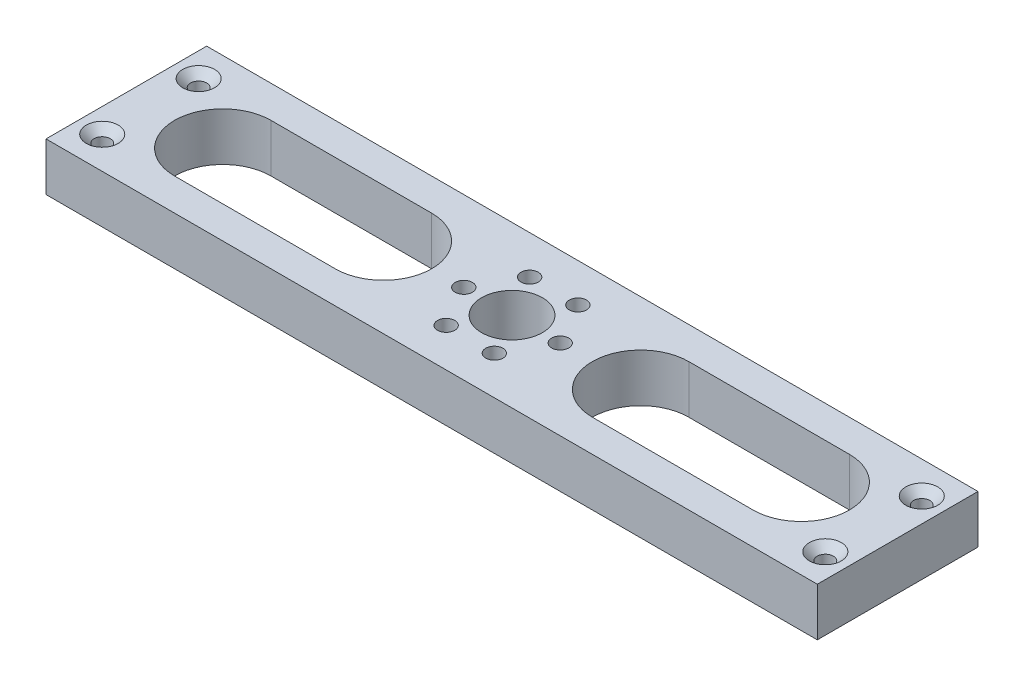
ISO-10303-21;
HEADER;
FILE_DESCRIPTION(('STEP AP214'),'2;1');
FILE_NAME('part.step','',(''),(''),'','','');
FILE_SCHEMA(('AUTOMOTIVE_DESIGN { 1 0 10303 214 1 1 1 1 }'));
ENDSEC;
DATA;
#1=APPLICATION_CONTEXT('core data for automotive mechanical design processes');
#2=APPLICATION_PROTOCOL_DEFINITION('international standard','automotive_design',2000,#1);
#3=PRODUCT_CONTEXT('',#1,'mechanical');
#4=PRODUCT('Part','Part','',(#3));
#5=PRODUCT_RELATED_PRODUCT_CATEGORY('part','',(#4));
#6=PRODUCT_DEFINITION_FORMATION('','',#4);
#7=PRODUCT_DEFINITION_CONTEXT('part definition',#1,'design');
#8=PRODUCT_DEFINITION('design','',#6,#7);
#9=PRODUCT_DEFINITION_SHAPE('','',#8);
#10=(LENGTH_UNIT() NAMED_UNIT(*) SI_UNIT(.MILLI.,.METRE.));
#11=(NAMED_UNIT(*) PLANE_ANGLE_UNIT() SI_UNIT($,.RADIAN.));
#12=(NAMED_UNIT(*) SI_UNIT($,.STERADIAN.) SOLID_ANGLE_UNIT());
#13=UNCERTAINTY_MEASURE_WITH_UNIT(LENGTH_MEASURE(1.E-05),#10,'distance_accuracy_value','');
#14=(GEOMETRIC_REPRESENTATION_CONTEXT(3) GLOBAL_UNCERTAINTY_ASSIGNED_CONTEXT((#13)) GLOBAL_UNIT_ASSIGNED_CONTEXT((#10,
#11,#12)) REPRESENTATION_CONTEXT('',''));
#15=CARTESIAN_POINT('',(0.,0.,0.));
#16=DIRECTION('',(0.,0.,1.));
#17=DIRECTION('',(1.,0.,0.));
#18=AXIS2_PLACEMENT_3D('',#15,#16,#17);
#19=CARTESIAN_POINT('',(76.2,4.7625,15.875));
#20=DIRECTION('',(-1.,0.,0.));
#21=DIRECTION('',(0.,0.,1.));
#22=AXIS2_PLACEMENT_3D('',#19,#20,#21);
#23=PLANE('',#22);
#24=DIRECTION('',(0.,0.,-1.));
#25=VECTOR('',#24,1.);
#26=CARTESIAN_POINT('',(76.2,-4.7625,15.875));
#27=LINE('',#26,#25);
#28=CARTESIAN_POINT('',(76.2,-4.7625,15.875));
#29=VERTEX_POINT('',#28);
#30=CARTESIAN_POINT('',(76.2,-4.7625,-15.875));
#31=VERTEX_POINT('',#30);
#32=EDGE_CURVE('E307',#29,#31,#27,.T.);
#33=ORIENTED_EDGE('',*,*,#32,.T.);
#34=DIRECTION('',(0.,-1.,0.));
#35=VECTOR('',#34,1.);
#36=CARTESIAN_POINT('',(76.2,4.7625,-15.875));
#37=LINE('',#36,#35);
#38=CARTESIAN_POINT('',(76.2,4.7625,-15.875));
#39=VERTEX_POINT('',#38);
#40=EDGE_CURVE('E11',#39,#31,#37,.T.);
#41=ORIENTED_EDGE('',*,*,#40,.F.);
#42=DIRECTION('',(0.,0.,-1.));
#43=VECTOR('',#42,1.);
#44=CARTESIAN_POINT('',(76.2,4.7625,15.875));
#45=LINE('',#44,#43);
#46=CARTESIAN_POINT('',(76.2,4.7625,15.875));
#47=VERTEX_POINT('',#46);
#48=EDGE_CURVE('E308',#47,#39,#45,.T.);
#49=ORIENTED_EDGE('',*,*,#48,.F.);
#50=DIRECTION('',(0.,-1.,0.));
#51=VECTOR('',#50,1.);
#52=CARTESIAN_POINT('',(76.2,4.7625,15.875));
#53=LINE('',#52,#51);
#54=EDGE_CURVE('E318',#47,#29,#53,.T.);
#55=ORIENTED_EDGE('',*,*,#54,.T.);
#56=EDGE_LOOP('',(#33,#41,#49,#55));
#57=FACE_BOUND('',#56,.T.);
#58=ADVANCED_FACE('F36',(#57),#23,.F.);
#59=CARTESIAN_POINT('',(-76.2,4.7625,-15.875));
#60=DIRECTION('',(0.,0.,1.));
#61=DIRECTION('',(1.,0.,0.));
#62=AXIS2_PLACEMENT_3D('',#59,#60,#61);
#63=PLANE('',#62);
#64=DIRECTION('',(-1.,0.,0.));
#65=VECTOR('',#64,1.);
#66=CARTESIAN_POINT('',(-76.2,-4.7625,-15.875));
#67=LINE('',#66,#65);
#68=CARTESIAN_POINT('',(-76.2,-4.7625,-15.875));
#69=VERTEX_POINT('',#68);
#70=EDGE_CURVE('E321',#31,#69,#67,.T.);
#71=ORIENTED_EDGE('',*,*,#70,.T.);
#72=DIRECTION('',(0.,-1.,0.));
#73=VECTOR('',#72,1.);
#74=CARTESIAN_POINT('',(-76.2,4.7625,-15.875));
#75=LINE('',#74,#73);
#76=CARTESIAN_POINT('',(-76.2,4.7625,-15.875));
#77=VERTEX_POINT('',#76);
#78=EDGE_CURVE('E43',#77,#69,#75,.T.);
#79=ORIENTED_EDGE('',*,*,#78,.F.);
#80=DIRECTION('',(-1.,0.,0.));
#81=VECTOR('',#80,1.);
#82=CARTESIAN_POINT('',(-76.2,4.7625,-15.875));
#83=LINE('',#82,#81);
#84=EDGE_CURVE('E311',#39,#77,#83,.T.);
#85=ORIENTED_EDGE('',*,*,#84,.F.);
#86=ORIENTED_EDGE('',*,*,#40,.T.);
#87=EDGE_LOOP('',(#71,#79,#85,#86));
#88=FACE_BOUND('',#87,.T.);
#89=ADVANCED_FACE('F350',(#88),#63,.F.);
#90=CARTESIAN_POINT('',(-76.2,4.7625,15.875));
#91=DIRECTION('',(1.,0.,0.));
#92=DIRECTION('',(0.,0.,-1.));
#93=AXIS2_PLACEMENT_3D('',#90,#91,#92);
#94=PLANE('',#93);
#95=DIRECTION('',(0.,0.,1.));
#96=VECTOR('',#95,1.);
#97=CARTESIAN_POINT('',(-76.2,-4.7625,15.875));
#98=LINE('',#97,#96);
#99=CARTESIAN_POINT('',(-76.2,-4.7625,15.875));
#100=VERTEX_POINT('',#99);
#101=EDGE_CURVE('E323',#69,#100,#98,.T.);
#102=ORIENTED_EDGE('',*,*,#101,.T.);
#103=DIRECTION('',(0.,-1.,0.));
#104=VECTOR('',#103,1.);
#105=CARTESIAN_POINT('',(-76.2,4.7625,15.875));
#106=LINE('',#105,#104);
#107=CARTESIAN_POINT('',(-76.2,4.7625,15.875));
#108=VERTEX_POINT('',#107);
#109=EDGE_CURVE('E328',#108,#100,#106,.T.);
#110=ORIENTED_EDGE('',*,*,#109,.F.);
#111=DIRECTION('',(0.,0.,1.));
#112=VECTOR('',#111,1.);
#113=CARTESIAN_POINT('',(-76.2,4.7625,15.875));
#114=LINE('',#113,#112);
#115=EDGE_CURVE('E314',#77,#108,#114,.T.);
#116=ORIENTED_EDGE('',*,*,#115,.F.);
#117=ORIENTED_EDGE('',*,*,#78,.T.);
#118=EDGE_LOOP('',(#102,#110,#116,#117));
#119=FACE_BOUND('',#118,.T.);
#120=ADVANCED_FACE('F335',(#119),#94,.F.);
#121=CARTESIAN_POINT('',(-76.2,4.7625,15.875));
#122=DIRECTION('',(0.,0.,-1.));
#123=DIRECTION('',(-1.,0.,0.));
#124=AXIS2_PLACEMENT_3D('',#121,#122,#123);
#125=PLANE('',#124);
#126=DIRECTION('',(1.,0.,0.));
#127=VECTOR('',#126,1.);
#128=CARTESIAN_POINT('',(-76.2,-4.7625,15.875));
#129=LINE('',#128,#127);
#130=EDGE_CURVE('E312',#100,#29,#129,.T.);
#131=ORIENTED_EDGE('',*,*,#130,.T.);
#132=ORIENTED_EDGE('',*,*,#54,.F.);
#133=DIRECTION('',(1.,0.,0.));
#134=VECTOR('',#133,1.);
#135=CARTESIAN_POINT('',(-76.2,4.7625,15.875));
#136=LINE('',#135,#134);
#137=EDGE_CURVE('E316',#108,#47,#136,.T.);
#138=ORIENTED_EDGE('',*,*,#137,.F.);
#139=ORIENTED_EDGE('',*,*,#109,.T.);
#140=EDGE_LOOP('',(#131,#132,#138,#139));
#141=FACE_BOUND('',#140,.T.);
#142=ADVANCED_FACE('F343',(#141),#125,.F.);
#143=CARTESIAN_POINT('',(0.,4.7625,0.));
#144=DIRECTION('',(0.,-1.,0.));
#145=DIRECTION('',(0.,0.,-1.));
#146=AXIS2_PLACEMENT_3D('',#143,#144,#145);
#147=PLANE('',#146);
#148=DIRECTION('',(1.,0.,0.));
#149=VECTOR('',#148,1.);
#150=CARTESIAN_POINT('',(-57.15,4.7625,9.525));
#151=LINE('',#150,#149);
#152=CARTESIAN_POINT('',(-57.15,4.7625,9.525));
#153=VERTEX_POINT('',#152);
#154=CARTESIAN_POINT('',(-25.4,4.7625,9.525));
#155=VERTEX_POINT('',#154);
#156=EDGE_CURVE('E154',#153,#155,#151,.T.);
#157=ORIENTED_EDGE('',*,*,#156,.F.);
#158=CARTESIAN_POINT('',(-57.15,4.7625,0.));
#159=DIRECTION('',(0.,1.,0.));
#160=DIRECTION('',(0.,0.,1.));
#161=AXIS2_PLACEMENT_3D('',#158,#159,#160);
#162=CIRCLE('',#161,9.525);
#163=CARTESIAN_POINT('',(-57.15,4.7625,-9.525));
#164=VERTEX_POINT('',#163);
#165=EDGE_CURVE('E50',#164,#153,#162,.T.);
#166=ORIENTED_EDGE('',*,*,#165,.F.);
#167=DIRECTION('',(-1.,0.,0.));
#168=VECTOR('',#167,1.);
#169=CARTESIAN_POINT('',(-57.15,4.7625,-9.525));
#170=LINE('',#169,#168);
#171=CARTESIAN_POINT('',(-25.4,4.7625,-9.525));
#172=VERTEX_POINT('',#171);
#173=EDGE_CURVE('E145',#172,#164,#170,.T.);
#174=ORIENTED_EDGE('',*,*,#173,.F.);
#175=CARTESIAN_POINT('',(-25.4,4.7625,0.));
#176=DIRECTION('',(0.,1.,0.));
#177=DIRECTION('',(0.,0.,1.));
#178=AXIS2_PLACEMENT_3D('',#175,#176,#177);
#179=CIRCLE('',#178,9.525);
#180=EDGE_CURVE('E148',#155,#172,#179,.T.);
#181=ORIENTED_EDGE('',*,*,#180,.F.);
#182=EDGE_LOOP('',(#157,#166,#174,#181));
#183=FACE_BOUND('',#182,.T.);
#184=DIRECTION('',(1.,0.,0.));
#185=VECTOR('',#184,1.);
#186=CARTESIAN_POINT('',(25.4,4.7625,9.525));
#187=LINE('',#186,#185);
#188=CARTESIAN_POINT('',(25.4,4.7625,9.525));
#189=VERTEX_POINT('',#188);
#190=CARTESIAN_POINT('',(57.15,4.7625,9.525));
#191=VERTEX_POINT('',#190);
#192=EDGE_CURVE('E180',#189,#191,#187,.T.);
#193=ORIENTED_EDGE('',*,*,#192,.F.);
#194=CARTESIAN_POINT('',(25.4,4.7625,0.));
#195=DIRECTION('',(0.,1.,0.));
#196=DIRECTION('',(0.,0.,1.));
#197=AXIS2_PLACEMENT_3D('',#194,#195,#196);
#198=CIRCLE('',#197,9.525);
#199=CARTESIAN_POINT('',(25.4,4.7625,-9.525));
#200=VERTEX_POINT('',#199);
#201=EDGE_CURVE('E58',#200,#189,#198,.T.);
#202=ORIENTED_EDGE('',*,*,#201,.F.);
#203=DIRECTION('',(-1.,0.,0.));
#204=VECTOR('',#203,1.);
#205=CARTESIAN_POINT('',(25.4,4.7625,-9.525));
#206=LINE('',#205,#204);
#207=CARTESIAN_POINT('',(57.15,4.7625,-9.525));
#208=VERTEX_POINT('',#207);
#209=EDGE_CURVE('E169',#208,#200,#206,.T.);
#210=ORIENTED_EDGE('',*,*,#209,.F.);
#211=CARTESIAN_POINT('',(57.15,4.7625,0.));
#212=DIRECTION('',(0.,1.,0.));
#213=DIRECTION('',(0.,0.,1.));
#214=AXIS2_PLACEMENT_3D('',#211,#212,#213);
#215=CIRCLE('',#214,9.525);
#216=EDGE_CURVE('E183',#191,#208,#215,.T.);
#217=ORIENTED_EDGE('',*,*,#216,.F.);
#218=EDGE_LOOP('',(#193,#202,#210,#217));
#219=FACE_BOUND('',#218,.T.);
#220=CARTESIAN_POINT('',(-4.76250000000002,4.7625,8.24889197104686));
#221=DIRECTION('',(0.,-1.,0.));
#222=DIRECTION('',(0.,0.,-1.));
#223=AXIS2_PLACEMENT_3D('',#220,#221,#222);
#224=CIRCLE('',#223,1.7);
#225=CARTESIAN_POINT('',(-4.76250000000002,4.7625,6.54889197104686));
#226=VERTEX_POINT('',#225);
#227=EDGE_CURVE('E202',#226,#226,#224,.T.);
#228=ORIENTED_EDGE('',*,*,#227,.T.);
#229=EDGE_LOOP('',(#228));
#230=FACE_BOUND('',#229,.T.);
#231=CARTESIAN_POINT('',(-9.52499999998021,4.7625,-1.52655665885959E-12));
#232=DIRECTION('',(0.,-1.,0.));
#233=DIRECTION('',(0.,0.,-1.));
#234=AXIS2_PLACEMENT_3D('',#231,#232,#233);
#235=CIRCLE('',#234,1.7);
#236=CARTESIAN_POINT('',(-9.52499999998021,4.7625,-1.70000000000152));
#237=VERTEX_POINT('',#236);
#238=EDGE_CURVE('E214',#237,#237,#235,.T.);
#239=ORIENTED_EDGE('',*,*,#238,.T.);
#240=EDGE_LOOP('',(#239));
#241=FACE_BOUND('',#240,.T.);
#242=CARTESIAN_POINT('',(-4.76249999997944,4.7625,-8.24889197104772));
#243=DIRECTION('',(0.,-1.,0.));
#244=DIRECTION('',(0.,0.,-1.));
#245=AXIS2_PLACEMENT_3D('',#242,#243,#244);
#246=CIRCLE('',#245,1.7);
#247=CARTESIAN_POINT('',(-4.76249999997944,4.7625,-9.94889197104772));
#248=VERTEX_POINT('',#247);
#249=EDGE_CURVE('E226',#248,#248,#246,.T.);
#250=ORIENTED_EDGE('',*,*,#249,.T.);
#251=EDGE_LOOP('',(#250));
#252=FACE_BOUND('',#251,.T.);
#253=CARTESIAN_POINT('',(4.76250000002058,4.7625,-8.24889197104681));
#254=DIRECTION('',(0.,-1.,0.));
#255=DIRECTION('',(0.,0.,-1.));
#256=AXIS2_PLACEMENT_3D('',#253,#254,#255);
#257=CIRCLE('',#256,1.7);
#258=CARTESIAN_POINT('',(4.76250000002058,4.7625,-9.9488919710468));
#259=VERTEX_POINT('',#258);
#260=EDGE_CURVE('E238',#259,#259,#257,.T.);
#261=ORIENTED_EDGE('',*,*,#260,.T.);
#262=EDGE_LOOP('',(#261));
#263=FACE_BOUND('',#262,.T.);
#264=CARTESIAN_POINT('',(9.5250000000198,4.7625,5.27355936696949E-13));
#265=DIRECTION('',(0.,-1.,0.));
#266=DIRECTION('',(0.,0.,-1.));
#267=AXIS2_PLACEMENT_3D('',#264,#265,#266);
#268=CIRCLE('',#267,1.7);
#269=CARTESIAN_POINT('',(9.5250000000198,4.7625,-1.69999999999947));
#270=VERTEX_POINT('',#269);
#271=EDGE_CURVE('E250',#270,#270,#268,.T.);
#272=ORIENTED_EDGE('',*,*,#271,.T.);
#273=EDGE_LOOP('',(#272));
#274=FACE_BOUND('',#273,.T.);
#275=CARTESIAN_POINT('',(4.7624999999995,4.7625,8.248891971047));
#276=DIRECTION('',(0.,-1.,0.));
#277=DIRECTION('',(0.,0.,-1.));
#278=AXIS2_PLACEMENT_3D('',#275,#276,#277);
#279=CIRCLE('',#278,1.7);
#280=CARTESIAN_POINT('',(4.7624999999995,4.7625,6.548891971047));
#281=VERTEX_POINT('',#280);
#282=EDGE_CURVE('E262',#281,#281,#279,.T.);
#283=ORIENTED_EDGE('',*,*,#282,.T.);
#284=EDGE_LOOP('',(#283));
#285=FACE_BOUND('',#284,.T.);
#286=CARTESIAN_POINT('',(0.,4.7625,0.));
#287=DIRECTION('',(0.,-1.,0.));
#288=DIRECTION('',(0.,0.,-1.));
#289=AXIS2_PLACEMENT_3D('',#286,#287,#288);
#290=CIRCLE('',#289,6.);
#291=CARTESIAN_POINT('',(0.,4.7625,-6.));
#292=VERTEX_POINT('',#291);
#293=EDGE_CURVE('E268',#292,#292,#290,.T.);
#294=ORIENTED_EDGE('',*,*,#293,.T.);
#295=EDGE_LOOP('',(#294));
#296=FACE_BOUND('',#295,.T.);
#297=CARTESIAN_POINT('',(-71.4375,4.7625,9.52499999999995));
#298=DIRECTION('',(0.,1.,0.));
#299=DIRECTION('',(0.,0.,1.));
#300=AXIS2_PLACEMENT_3D('',#297,#298,#299);
#301=CIRCLE('',#300,3.15);
#302=CARTESIAN_POINT('',(-71.4375,4.7625,12.675));
#303=VERTEX_POINT('',#302);
#304=EDGE_CURVE('E271',#303,#303,#301,.T.);
#305=ORIENTED_EDGE('',*,*,#304,.F.);
#306=EDGE_LOOP('',(#305));
#307=FACE_BOUND('',#306,.T.);
#308=CARTESIAN_POINT('',(71.4374999999999,4.7625,9.52499999999992));
#309=DIRECTION('',(0.,1.,0.));
#310=DIRECTION('',(0.,0.,1.));
#311=AXIS2_PLACEMENT_3D('',#308,#309,#310);
#312=CIRCLE('',#311,3.15);
#313=CARTESIAN_POINT('',(71.4374999999999,4.7625,12.6749999999999));
#314=VERTEX_POINT('',#313);
#315=EDGE_CURVE('E280',#314,#314,#312,.T.);
#316=ORIENTED_EDGE('',*,*,#315,.F.);
#317=EDGE_LOOP('',(#316));
#318=FACE_BOUND('',#317,.T.);
#319=CARTESIAN_POINT('',(71.4374999999999,4.7625,-9.52500000000006));
#320=DIRECTION('',(0.,1.,0.));
#321=DIRECTION('',(0.,0.,1.));
#322=AXIS2_PLACEMENT_3D('',#319,#320,#321);
#323=CIRCLE('',#322,3.15);
#324=CARTESIAN_POINT('',(71.4374999999999,4.7625,-6.37500000000006));
#325=VERTEX_POINT('',#324);
#326=EDGE_CURVE('E289',#325,#325,#323,.T.);
#327=ORIENTED_EDGE('',*,*,#326,.F.);
#328=EDGE_LOOP('',(#327));
#329=FACE_BOUND('',#328,.T.);
#330=CARTESIAN_POINT('',(-71.4375,4.7625,-9.52500000000006));
#331=DIRECTION('',(0.,1.,0.));
#332=DIRECTION('',(0.,0.,1.));
#333=AXIS2_PLACEMENT_3D('',#330,#331,#332);
#334=CIRCLE('',#333,3.15);
#335=CARTESIAN_POINT('',(-71.4375,4.7625,-6.37500000000006));
#336=VERTEX_POINT('',#335);
#337=EDGE_CURVE('E298',#336,#336,#334,.T.);
#338=ORIENTED_EDGE('',*,*,#337,.F.);
#339=EDGE_LOOP('',(#338));
#340=FACE_BOUND('',#339,.T.);
#341=ORIENTED_EDGE('',*,*,#48,.T.);
#342=ORIENTED_EDGE('',*,*,#84,.T.);
#343=ORIENTED_EDGE('',*,*,#115,.T.);
#344=ORIENTED_EDGE('',*,*,#137,.T.);
#345=EDGE_LOOP('',(#341,#342,#343,#344));
#346=FACE_BOUND('',#345,.T.);
#347=ADVANCED_FACE('F349',(#183,#219,#230,#241,#252,#263,#274,#285,#296,#307,#318,#329,#340,
#346),#147,.F.);
#348=CARTESIAN_POINT('',(0.,-4.7625,0.));
#349=DIRECTION('',(0.,-1.,0.));
#350=DIRECTION('',(0.,0.,-1.));
#351=AXIS2_PLACEMENT_3D('',#348,#349,#350);
#352=PLANE('',#351);
#353=CARTESIAN_POINT('',(-57.15,-4.7625,0.));
#354=DIRECTION('',(0.,1.,0.));
#355=DIRECTION('',(0.,0.,1.));
#356=AXIS2_PLACEMENT_3D('',#353,#354,#355);
#357=CIRCLE('',#356,9.525);
#358=CARTESIAN_POINT('',(-57.15,-4.7625,-9.525));
#359=VERTEX_POINT('',#358);
#360=CARTESIAN_POINT('',(-57.15,-4.7625,9.525));
#361=VERTEX_POINT('',#360);
#362=EDGE_CURVE('E126',#359,#361,#357,.T.);
#363=ORIENTED_EDGE('',*,*,#362,.T.);
#364=DIRECTION('',(1.,0.,0.));
#365=VECTOR('',#364,1.);
#366=CARTESIAN_POINT('',(-57.15,-4.7625,9.525));
#367=LINE('',#366,#365);
#368=CARTESIAN_POINT('',(-25.4,-4.7625,9.525));
#369=VERTEX_POINT('',#368);
#370=EDGE_CURVE('E136',#361,#369,#367,.T.);
#371=ORIENTED_EDGE('',*,*,#370,.T.);
#372=CARTESIAN_POINT('',(-25.4,-4.7625,0.));
#373=DIRECTION('',(0.,1.,0.));
#374=DIRECTION('',(0.,0.,1.));
#375=AXIS2_PLACEMENT_3D('',#372,#373,#374);
#376=CIRCLE('',#375,9.525);
#377=CARTESIAN_POINT('',(-25.4,-4.7625,-9.525));
#378=VERTEX_POINT('',#377);
#379=EDGE_CURVE('E140',#369,#378,#376,.T.);
#380=ORIENTED_EDGE('',*,*,#379,.T.);
#381=DIRECTION('',(-1.,0.,0.));
#382=VECTOR('',#381,1.);
#383=CARTESIAN_POINT('',(-57.15,-4.7625,-9.525));
#384=LINE('',#383,#382);
#385=EDGE_CURVE('E132',#378,#359,#384,.T.);
#386=ORIENTED_EDGE('',*,*,#385,.T.);
#387=EDGE_LOOP('',(#363,#371,#380,#386));
#388=FACE_BOUND('',#387,.T.);
#389=CARTESIAN_POINT('',(25.4,-4.7625,0.));
#390=DIRECTION('',(0.,1.,0.));
#391=DIRECTION('',(0.,0.,1.));
#392=AXIS2_PLACEMENT_3D('',#389,#390,#391);
#393=CIRCLE('',#392,9.525);
#394=CARTESIAN_POINT('',(25.4,-4.7625,-9.525));
#395=VERTEX_POINT('',#394);
#396=CARTESIAN_POINT('',(25.4,-4.7625,9.525));
#397=VERTEX_POINT('',#396);
#398=EDGE_CURVE('E165',#395,#397,#393,.T.);
#399=ORIENTED_EDGE('',*,*,#398,.T.);
#400=DIRECTION('',(1.,0.,0.));
#401=VECTOR('',#400,1.);
#402=CARTESIAN_POINT('',(25.4,-4.7625,9.525));
#403=LINE('',#402,#401);
#404=CARTESIAN_POINT('',(57.15,-4.7625,9.525));
#405=VERTEX_POINT('',#404);
#406=EDGE_CURVE('E168',#397,#405,#403,.T.);
#407=ORIENTED_EDGE('',*,*,#406,.T.);
#408=CARTESIAN_POINT('',(57.15,-4.7625,0.));
#409=DIRECTION('',(0.,1.,0.));
#410=DIRECTION('',(0.,0.,1.));
#411=AXIS2_PLACEMENT_3D('',#408,#409,#410);
#412=CIRCLE('',#411,9.525);
#413=CARTESIAN_POINT('',(57.15,-4.7625,-9.525));
#414=VERTEX_POINT('',#413);
#415=EDGE_CURVE('E172',#405,#414,#412,.T.);
#416=ORIENTED_EDGE('',*,*,#415,.T.);
#417=DIRECTION('',(-1.,0.,0.));
#418=VECTOR('',#417,1.);
#419=CARTESIAN_POINT('',(25.4,-4.7625,-9.525));
#420=LINE('',#419,#418);
#421=EDGE_CURVE('E175',#414,#395,#420,.T.);
#422=ORIENTED_EDGE('',*,*,#421,.T.);
#423=EDGE_LOOP('',(#399,#407,#416,#422));
#424=FACE_BOUND('',#423,.T.);
#425=CARTESIAN_POINT('',(-4.76250000000002,-4.7625,8.24889197104686));
#426=DIRECTION('',(0.,-1.,0.));
#427=DIRECTION('',(0.,0.,-1.));
#428=AXIS2_PLACEMENT_3D('',#425,#426,#427);
#429=CIRCLE('',#428,2.25);
#430=CARTESIAN_POINT('',(-4.76250000000002,-4.7625,5.99889197104686));
#431=VERTEX_POINT('',#430);
#432=EDGE_CURVE('E161',#431,#431,#429,.T.);
#433=ORIENTED_EDGE('',*,*,#432,.F.);
#434=EDGE_LOOP('',(#433));
#435=FACE_BOUND('',#434,.T.);
#436=CARTESIAN_POINT('',(-9.52499999998021,-4.7625,-1.52655665885959E-12));
#437=DIRECTION('',(0.,-1.,0.));
#438=DIRECTION('',(0.,0.,-1.));
#439=AXIS2_PLACEMENT_3D('',#436,#437,#438);
#440=CIRCLE('',#439,2.25);
#441=CARTESIAN_POINT('',(-9.52499999998021,-4.7625,-2.25000000000152));
#442=VERTEX_POINT('',#441);
#443=EDGE_CURVE('E205',#442,#442,#440,.T.);
#444=ORIENTED_EDGE('',*,*,#443,.F.);
#445=EDGE_LOOP('',(#444));
#446=FACE_BOUND('',#445,.T.);
#447=CARTESIAN_POINT('',(-4.76249999997944,-4.7625,-8.24889197104772));
#448=DIRECTION('',(0.,-1.,0.));
#449=DIRECTION('',(0.,0.,-1.));
#450=AXIS2_PLACEMENT_3D('',#447,#448,#449);
#451=CIRCLE('',#450,2.25);
#452=CARTESIAN_POINT('',(-4.76249999997944,-4.7625,-10.4988919710477));
#453=VERTEX_POINT('',#452);
#454=EDGE_CURVE('E217',#453,#453,#451,.T.);
#455=ORIENTED_EDGE('',*,*,#454,.F.);
#456=EDGE_LOOP('',(#455));
#457=FACE_BOUND('',#456,.T.);
#458=CARTESIAN_POINT('',(4.76250000002058,-4.7625,-8.24889197104681));
#459=DIRECTION('',(0.,-1.,0.));
#460=DIRECTION('',(0.,0.,-1.));
#461=AXIS2_PLACEMENT_3D('',#458,#459,#460);
#462=CIRCLE('',#461,2.25);
#463=CARTESIAN_POINT('',(4.76250000002058,-4.7625,-10.4988919710468));
#464=VERTEX_POINT('',#463);
#465=EDGE_CURVE('E229',#464,#464,#462,.T.);
#466=ORIENTED_EDGE('',*,*,#465,.F.);
#467=EDGE_LOOP('',(#466));
#468=FACE_BOUND('',#467,.T.);
#469=CARTESIAN_POINT('',(9.5250000000198,-4.7625,5.27355936696949E-13));
#470=DIRECTION('',(0.,-1.,0.));
#471=DIRECTION('',(0.,0.,-1.));
#472=AXIS2_PLACEMENT_3D('',#469,#470,#471);
#473=CIRCLE('',#472,2.25);
#474=CARTESIAN_POINT('',(9.5250000000198,-4.7625,-2.24999999999947));
#475=VERTEX_POINT('',#474);
#476=EDGE_CURVE('E241',#475,#475,#473,.T.);
#477=ORIENTED_EDGE('',*,*,#476,.F.);
#478=EDGE_LOOP('',(#477));
#479=FACE_BOUND('',#478,.T.);
#480=CARTESIAN_POINT('',(4.7624999999995,-4.7625,8.248891971047));
#481=DIRECTION('',(0.,-1.,0.));
#482=DIRECTION('',(0.,0.,-1.));
#483=AXIS2_PLACEMENT_3D('',#480,#481,#482);
#484=CIRCLE('',#483,2.25);
#485=CARTESIAN_POINT('',(4.7624999999995,-4.7625,5.99889197104701));
#486=VERTEX_POINT('',#485);
#487=EDGE_CURVE('E253',#486,#486,#484,.T.);
#488=ORIENTED_EDGE('',*,*,#487,.F.);
#489=EDGE_LOOP('',(#488));
#490=FACE_BOUND('',#489,.T.);
#491=CARTESIAN_POINT('',(0.,-4.7625,0.));
#492=DIRECTION('',(0.,-1.,0.));
#493=DIRECTION('',(0.,0.,-1.));
#494=AXIS2_PLACEMENT_3D('',#491,#492,#493);
#495=CIRCLE('',#494,5.99999999999999);
#496=CARTESIAN_POINT('',(0.,-4.7625,-5.99999999999999));
#497=VERTEX_POINT('',#496);
#498=EDGE_CURVE('E265',#497,#497,#495,.T.);
#499=ORIENTED_EDGE('',*,*,#498,.F.);
#500=EDGE_LOOP('',(#499));
#501=FACE_BOUND('',#500,.T.);
#502=CARTESIAN_POINT('',(-71.4375,-4.7625,9.52499999999995));
#503=DIRECTION('',(0.,1.,0.));
#504=DIRECTION('',(0.,0.,1.));
#505=AXIS2_PLACEMENT_3D('',#502,#503,#504);
#506=CIRCLE('',#505,1.6);
#507=CARTESIAN_POINT('',(-71.4375,-4.7625,11.125));
#508=VERTEX_POINT('',#507);
#509=EDGE_CURVE('E277',#508,#508,#506,.T.);
#510=ORIENTED_EDGE('',*,*,#509,.T.);
#511=EDGE_LOOP('',(#510));
#512=FACE_BOUND('',#511,.T.);
#513=CARTESIAN_POINT('',(71.4374999999999,-4.7625,9.52499999999992));
#514=DIRECTION('',(0.,1.,0.));
#515=DIRECTION('',(0.,0.,1.));
#516=AXIS2_PLACEMENT_3D('',#513,#514,#515);
#517=CIRCLE('',#516,1.6);
#518=CARTESIAN_POINT('',(71.4374999999999,-4.7625,11.1249999999999));
#519=VERTEX_POINT('',#518);
#520=EDGE_CURVE('E286',#519,#519,#517,.T.);
#521=ORIENTED_EDGE('',*,*,#520,.T.);
#522=EDGE_LOOP('',(#521));
#523=FACE_BOUND('',#522,.T.);
#524=CARTESIAN_POINT('',(71.4374999999999,-4.7625,-9.52500000000006));
#525=DIRECTION('',(0.,1.,0.));
#526=DIRECTION('',(0.,0.,1.));
#527=AXIS2_PLACEMENT_3D('',#524,#525,#526);
#528=CIRCLE('',#527,1.6);
#529=CARTESIAN_POINT('',(71.4374999999999,-4.7625,-7.92500000000006));
#530=VERTEX_POINT('',#529);
#531=EDGE_CURVE('E295',#530,#530,#528,.T.);
#532=ORIENTED_EDGE('',*,*,#531,.T.);
#533=EDGE_LOOP('',(#532));
#534=FACE_BOUND('',#533,.T.);
#535=CARTESIAN_POINT('',(-71.4375,-4.7625,-9.52500000000006));
#536=DIRECTION('',(0.,1.,0.));
#537=DIRECTION('',(0.,0.,1.));
#538=AXIS2_PLACEMENT_3D('',#535,#536,#537);
#539=CIRCLE('',#538,1.6);
#540=CARTESIAN_POINT('',(-71.4375,-4.7625,-7.92500000000005));
#541=VERTEX_POINT('',#540);
#542=EDGE_CURVE('E304',#541,#541,#539,.T.);
#543=ORIENTED_EDGE('',*,*,#542,.T.);
#544=EDGE_LOOP('',(#543));
#545=FACE_BOUND('',#544,.T.);
#546=ORIENTED_EDGE('',*,*,#32,.F.);
#547=ORIENTED_EDGE('',*,*,#130,.F.);
#548=ORIENTED_EDGE('',*,*,#101,.F.);
#549=ORIENTED_EDGE('',*,*,#70,.F.);
#550=EDGE_LOOP('',(#546,#547,#548,#549));
#551=FACE_BOUND('',#550,.T.);
#552=ADVANCED_FACE('F142',(#388,#424,#435,#446,#457,#468,#479,#490,#501,#512,#523,#534,#545,
#551),#352,.T.);
#553=CARTESIAN_POINT('',(-71.4375,4.7625,-9.52500000000006));
#554=DIRECTION('',(0.,1.,0.));
#555=DIRECTION('',(0.,0.,1.));
#556=AXIS2_PLACEMENT_3D('',#553,#554,#555);
#557=CYLINDRICAL_SURFACE('',#556,1.6);
#558=ORIENTED_EDGE('',*,*,#542,.F.);
#559=EDGE_LOOP('',(#558));
#560=FACE_BOUND('',#559,.T.);
#561=CARTESIAN_POINT('',(-71.4375,3.2125,-9.52500000000006));
#562=DIRECTION('',(0.,1.,0.));
#563=DIRECTION('',(0.,0.,1.));
#564=AXIS2_PLACEMENT_3D('',#561,#562,#563);
#565=CIRCLE('',#564,1.6);
#566=CARTESIAN_POINT('',(-71.4375,3.2125,-7.92500000000005));
#567=VERTEX_POINT('',#566);
#568=EDGE_CURVE('E301',#567,#567,#565,.T.);
#569=ORIENTED_EDGE('',*,*,#568,.T.);
#570=EDGE_LOOP('',(#569));
#571=FACE_BOUND('',#570,.T.);
#572=ADVANCED_FACE('F362',(#560,#571),#557,.F.);
#573=CARTESIAN_POINT('',(-71.4375,4.7625,-9.52500000000006));
#574=DIRECTION('',(0.,1.,0.));
#575=DIRECTION('',(0.,0.,1.));
#576=AXIS2_PLACEMENT_3D('',#573,#574,#575);
#577=CONICAL_SURFACE('',#576,3.15,0.785398163397447);
#578=ORIENTED_EDGE('',*,*,#568,.F.);
#579=EDGE_LOOP('',(#578));
#580=FACE_BOUND('',#579,.T.);
#581=ORIENTED_EDGE('',*,*,#337,.T.);
#582=EDGE_LOOP('',(#581));
#583=FACE_BOUND('',#582,.T.);
#584=ADVANCED_FACE('F368',(#580,#583),#577,.F.);
#585=CARTESIAN_POINT('',(71.4374999999999,4.7625,-9.52500000000006));
#586=DIRECTION('',(0.,1.,0.));
#587=DIRECTION('',(0.,0.,1.));
#588=AXIS2_PLACEMENT_3D('',#585,#586,#587);
#589=CYLINDRICAL_SURFACE('',#588,1.6);
#590=ORIENTED_EDGE('',*,*,#531,.F.);
#591=EDGE_LOOP('',(#590));
#592=FACE_BOUND('',#591,.T.);
#593=CARTESIAN_POINT('',(71.4374999999999,3.2125,-9.52500000000006));
#594=DIRECTION('',(0.,1.,0.));
#595=DIRECTION('',(0.,0.,1.));
#596=AXIS2_PLACEMENT_3D('',#593,#594,#595);
#597=CIRCLE('',#596,1.6);
#598=CARTESIAN_POINT('',(71.4374999999999,3.2125,-7.92500000000006));
#599=VERTEX_POINT('',#598);
#600=EDGE_CURVE('E292',#599,#599,#597,.T.);
#601=ORIENTED_EDGE('',*,*,#600,.T.);
#602=EDGE_LOOP('',(#601));
#603=FACE_BOUND('',#602,.T.);
#604=ADVANCED_FACE('F372',(#592,#603),#589,.F.);
#605=CARTESIAN_POINT('',(71.4374999999999,4.7625,-9.52500000000006));
#606=DIRECTION('',(0.,1.,0.));
#607=DIRECTION('',(0.,0.,1.));
#608=AXIS2_PLACEMENT_3D('',#605,#606,#607);
#609=CONICAL_SURFACE('',#608,3.15,0.785398163397447);
#610=ORIENTED_EDGE('',*,*,#600,.F.);
#611=EDGE_LOOP('',(#610));
#612=FACE_BOUND('',#611,.T.);
#613=ORIENTED_EDGE('',*,*,#326,.T.);
#614=EDGE_LOOP('',(#613));
#615=FACE_BOUND('',#614,.T.);
#616=ADVANCED_FACE('F376',(#612,#615),#609,.F.);
#617=CARTESIAN_POINT('',(71.4374999999999,4.7625,9.52499999999992));
#618=DIRECTION('',(0.,1.,0.));
#619=DIRECTION('',(0.,0.,1.));
#620=AXIS2_PLACEMENT_3D('',#617,#618,#619);
#621=CYLINDRICAL_SURFACE('',#620,1.6);
#622=ORIENTED_EDGE('',*,*,#520,.F.);
#623=EDGE_LOOP('',(#622));
#624=FACE_BOUND('',#623,.T.);
#625=CARTESIAN_POINT('',(71.4374999999999,3.2125,9.52499999999992));
#626=DIRECTION('',(0.,1.,0.));
#627=DIRECTION('',(0.,0.,1.));
#628=AXIS2_PLACEMENT_3D('',#625,#626,#627);
#629=CIRCLE('',#628,1.6);
#630=CARTESIAN_POINT('',(71.4374999999999,3.2125,11.1249999999999));
#631=VERTEX_POINT('',#630);
#632=EDGE_CURVE('E283',#631,#631,#629,.T.);
#633=ORIENTED_EDGE('',*,*,#632,.T.);
#634=EDGE_LOOP('',(#633));
#635=FACE_BOUND('',#634,.T.);
#636=ADVANCED_FACE('F380',(#624,#635),#621,.F.);
#637=CARTESIAN_POINT('',(71.4374999999999,4.7625,9.52499999999992));
#638=DIRECTION('',(0.,1.,0.));
#639=DIRECTION('',(0.,0.,1.));
#640=AXIS2_PLACEMENT_3D('',#637,#638,#639);
#641=CONICAL_SURFACE('',#640,3.15,0.785398163397447);
#642=ORIENTED_EDGE('',*,*,#632,.F.);
#643=EDGE_LOOP('',(#642));
#644=FACE_BOUND('',#643,.T.);
#645=ORIENTED_EDGE('',*,*,#315,.T.);
#646=EDGE_LOOP('',(#645));
#647=FACE_BOUND('',#646,.T.);
#648=ADVANCED_FACE('F384',(#644,#647),#641,.F.);
#649=CARTESIAN_POINT('',(-71.4375,4.7625,9.52499999999995));
#650=DIRECTION('',(0.,1.,0.));
#651=DIRECTION('',(0.,0.,1.));
#652=AXIS2_PLACEMENT_3D('',#649,#650,#651);
#653=CYLINDRICAL_SURFACE('',#652,1.6);
#654=ORIENTED_EDGE('',*,*,#509,.F.);
#655=EDGE_LOOP('',(#654));
#656=FACE_BOUND('',#655,.T.);
#657=CARTESIAN_POINT('',(-71.4375,3.2125,9.52499999999995));
#658=DIRECTION('',(0.,1.,0.));
#659=DIRECTION('',(0.,0.,1.));
#660=AXIS2_PLACEMENT_3D('',#657,#658,#659);
#661=CIRCLE('',#660,1.6);
#662=CARTESIAN_POINT('',(-71.4375,3.2125,11.125));
#663=VERTEX_POINT('',#662);
#664=EDGE_CURVE('E274',#663,#663,#661,.T.);
#665=ORIENTED_EDGE('',*,*,#664,.T.);
#666=EDGE_LOOP('',(#665));
#667=FACE_BOUND('',#666,.T.);
#668=ADVANCED_FACE('F388',(#656,#667),#653,.F.);
#669=CARTESIAN_POINT('',(-71.4375,4.7625,9.52499999999995));
#670=DIRECTION('',(0.,1.,0.));
#671=DIRECTION('',(0.,0.,1.));
#672=AXIS2_PLACEMENT_3D('',#669,#670,#671);
#673=CONICAL_SURFACE('',#672,3.15,0.785398163397447);
#674=ORIENTED_EDGE('',*,*,#664,.F.);
#675=EDGE_LOOP('',(#674));
#676=FACE_BOUND('',#675,.T.);
#677=ORIENTED_EDGE('',*,*,#304,.T.);
#678=EDGE_LOOP('',(#677));
#679=FACE_BOUND('',#678,.T.);
#680=ADVANCED_FACE('F392',(#676,#679),#673,.F.);
#681=CARTESIAN_POINT('',(0.,-4.7625,0.));
#682=DIRECTION('',(0.,-1.,0.));
#683=DIRECTION('',(0.,0.,-1.));
#684=AXIS2_PLACEMENT_3D('',#681,#682,#683);
#685=CYLINDRICAL_SURFACE('',#684,5.99999999999999);
#686=ORIENTED_EDGE('',*,*,#293,.F.);
#687=EDGE_LOOP('',(#686));
#688=FACE_BOUND('',#687,.T.);
#689=ORIENTED_EDGE('',*,*,#498,.T.);
#690=EDGE_LOOP('',(#689));
#691=FACE_BOUND('',#690,.T.);
#692=ADVANCED_FACE('F396',(#688,#691),#685,.F.);
#693=CARTESIAN_POINT('',(4.7624999999995,-4.7625,8.248891971047));
#694=DIRECTION('',(0.,-1.,0.));
#695=DIRECTION('',(0.,0.,-1.));
#696=AXIS2_PLACEMENT_3D('',#693,#694,#695);
#697=CYLINDRICAL_SURFACE('',#696,1.7);
#698=ORIENTED_EDGE('',*,*,#282,.F.);
#699=EDGE_LOOP('',(#698));
#700=FACE_BOUND('',#699,.T.);
#701=CARTESIAN_POINT('',(4.7624999999995,-2.7625,8.248891971047));
#702=DIRECTION('',(0.,-1.,0.));
#703=DIRECTION('',(0.,0.,-1.));
#704=AXIS2_PLACEMENT_3D('',#701,#702,#703);
#705=CIRCLE('',#704,1.7);
#706=CARTESIAN_POINT('',(4.7624999999995,-2.7625,6.548891971047));
#707=VERTEX_POINT('',#706);
#708=EDGE_CURVE('E259',#707,#707,#705,.T.);
#709=ORIENTED_EDGE('',*,*,#708,.T.);
#710=EDGE_LOOP('',(#709));
#711=FACE_BOUND('',#710,.T.);
#712=ADVANCED_FACE('F400',(#700,#711),#697,.F.);
#713=CARTESIAN_POINT('',(6.4624999999995,-2.7625,8.248891971047));
#714=DIRECTION('',(0.,1.,0.));
#715=DIRECTION('',(0.,0.,1.));
#716=AXIS2_PLACEMENT_3D('',#713,#714,#715);
#717=PLANE('',#716);
#718=ORIENTED_EDGE('',*,*,#708,.F.);
#719=EDGE_LOOP('',(#718));
#720=FACE_BOUND('',#719,.T.);
#721=CARTESIAN_POINT('',(4.7624999999995,-2.7625,8.248891971047));
#722=DIRECTION('',(0.,-1.,0.));
#723=DIRECTION('',(0.,0.,-1.));
#724=AXIS2_PLACEMENT_3D('',#721,#722,#723);
#725=CIRCLE('',#724,2.25);
#726=CARTESIAN_POINT('',(4.7624999999995,-2.7625,5.99889197104701));
#727=VERTEX_POINT('',#726);
#728=EDGE_CURVE('E256',#727,#727,#725,.T.);
#729=ORIENTED_EDGE('',*,*,#728,.T.);
#730=EDGE_LOOP('',(#729));
#731=FACE_BOUND('',#730,.T.);
#732=ADVANCED_FACE('F404',(#720,#731),#717,.F.);
#733=CARTESIAN_POINT('',(4.7624999999995,-4.7625,8.248891971047));
#734=DIRECTION('',(0.,-1.,0.));
#735=DIRECTION('',(0.,0.,-1.));
#736=AXIS2_PLACEMENT_3D('',#733,#734,#735);
#737=CYLINDRICAL_SURFACE('',#736,2.25);
#738=ORIENTED_EDGE('',*,*,#728,.F.);
#739=EDGE_LOOP('',(#738));
#740=FACE_BOUND('',#739,.T.);
#741=ORIENTED_EDGE('',*,*,#487,.T.);
#742=EDGE_LOOP('',(#741));
#743=FACE_BOUND('',#742,.T.);
#744=ADVANCED_FACE('F408',(#740,#743),#737,.F.);
#745=CARTESIAN_POINT('',(9.5250000000198,-4.7625,5.27355936696949E-13));
#746=DIRECTION('',(0.,-1.,0.));
#747=DIRECTION('',(0.,0.,-1.));
#748=AXIS2_PLACEMENT_3D('',#745,#746,#747);
#749=CYLINDRICAL_SURFACE('',#748,1.7);
#750=ORIENTED_EDGE('',*,*,#271,.F.);
#751=EDGE_LOOP('',(#750));
#752=FACE_BOUND('',#751,.T.);
#753=CARTESIAN_POINT('',(9.5250000000198,-2.7625,5.27355936696949E-13));
#754=DIRECTION('',(0.,-1.,0.));
#755=DIRECTION('',(0.,0.,-1.));
#756=AXIS2_PLACEMENT_3D('',#753,#754,#755);
#757=CIRCLE('',#756,1.7);
#758=CARTESIAN_POINT('',(9.5250000000198,-2.7625,-1.69999999999947));
#759=VERTEX_POINT('',#758);
#760=EDGE_CURVE('E247',#759,#759,#757,.T.);
#761=ORIENTED_EDGE('',*,*,#760,.T.);
#762=EDGE_LOOP('',(#761));
#763=FACE_BOUND('',#762,.T.);
#764=ADVANCED_FACE('F412',(#752,#763),#749,.F.);
#765=CARTESIAN_POINT('',(11.2250000000198,-2.7625,5.27355936696949E-13));
#766=DIRECTION('',(0.,1.,0.));
#767=DIRECTION('',(0.,0.,1.));
#768=AXIS2_PLACEMENT_3D('',#765,#766,#767);
#769=PLANE('',#768);
#770=ORIENTED_EDGE('',*,*,#760,.F.);
#771=EDGE_LOOP('',(#770));
#772=FACE_BOUND('',#771,.T.);
#773=CARTESIAN_POINT('',(9.5250000000198,-2.7625,5.27355936696949E-13));
#774=DIRECTION('',(0.,-1.,0.));
#775=DIRECTION('',(0.,0.,-1.));
#776=AXIS2_PLACEMENT_3D('',#773,#774,#775);
#777=CIRCLE('',#776,2.25);
#778=CARTESIAN_POINT('',(9.5250000000198,-2.7625,-2.24999999999947));
#779=VERTEX_POINT('',#778);
#780=EDGE_CURVE('E244',#779,#779,#777,.T.);
#781=ORIENTED_EDGE('',*,*,#780,.T.);
#782=EDGE_LOOP('',(#781));
#783=FACE_BOUND('',#782,.T.);
#784=ADVANCED_FACE('F416',(#772,#783),#769,.F.);
#785=CARTESIAN_POINT('',(9.5250000000198,-4.7625,5.27355936696949E-13));
#786=DIRECTION('',(0.,-1.,0.));
#787=DIRECTION('',(0.,0.,-1.));
#788=AXIS2_PLACEMENT_3D('',#785,#786,#787);
#789=CYLINDRICAL_SURFACE('',#788,2.25);
#790=ORIENTED_EDGE('',*,*,#780,.F.);
#791=EDGE_LOOP('',(#790));
#792=FACE_BOUND('',#791,.T.);
#793=ORIENTED_EDGE('',*,*,#476,.T.);
#794=EDGE_LOOP('',(#793));
#795=FACE_BOUND('',#794,.T.);
#796=ADVANCED_FACE('F420',(#792,#795),#789,.F.);
#797=CARTESIAN_POINT('',(4.76250000002058,-4.7625,-8.24889197104681));
#798=DIRECTION('',(0.,-1.,0.));
#799=DIRECTION('',(0.,0.,-1.));
#800=AXIS2_PLACEMENT_3D('',#797,#798,#799);
#801=CYLINDRICAL_SURFACE('',#800,1.7);
#802=ORIENTED_EDGE('',*,*,#260,.F.);
#803=EDGE_LOOP('',(#802));
#804=FACE_BOUND('',#803,.T.);
#805=CARTESIAN_POINT('',(4.76250000002058,-2.7625,-8.24889197104681));
#806=DIRECTION('',(0.,-1.,0.));
#807=DIRECTION('',(0.,0.,-1.));
#808=AXIS2_PLACEMENT_3D('',#805,#806,#807);
#809=CIRCLE('',#808,1.7);
#810=CARTESIAN_POINT('',(4.76250000002058,-2.7625,-9.94889197104681));
#811=VERTEX_POINT('',#810);
#812=EDGE_CURVE('E235',#811,#811,#809,.T.);
#813=ORIENTED_EDGE('',*,*,#812,.T.);
#814=EDGE_LOOP('',(#813));
#815=FACE_BOUND('',#814,.T.);
#816=ADVANCED_FACE('F424',(#804,#815),#801,.F.);
#817=CARTESIAN_POINT('',(6.46250000002058,-2.7625,-8.24889197104681));
#818=DIRECTION('',(0.,1.,0.));
#819=DIRECTION('',(0.,0.,1.));
#820=AXIS2_PLACEMENT_3D('',#817,#818,#819);
#821=PLANE('',#820);
#822=ORIENTED_EDGE('',*,*,#812,.F.);
#823=EDGE_LOOP('',(#822));
#824=FACE_BOUND('',#823,.T.);
#825=CARTESIAN_POINT('',(4.76250000002058,-2.7625,-8.24889197104681));
#826=DIRECTION('',(0.,-1.,0.));
#827=DIRECTION('',(0.,0.,-1.));
#828=AXIS2_PLACEMENT_3D('',#825,#826,#827);
#829=CIRCLE('',#828,2.25);
#830=CARTESIAN_POINT('',(4.76250000002058,-2.7625,-10.4988919710468));
#831=VERTEX_POINT('',#830);
#832=EDGE_CURVE('E232',#831,#831,#829,.T.);
#833=ORIENTED_EDGE('',*,*,#832,.T.);
#834=EDGE_LOOP('',(#833));
#835=FACE_BOUND('',#834,.T.);
#836=ADVANCED_FACE('F428',(#824,#835),#821,.F.);
#837=CARTESIAN_POINT('',(4.76250000002058,-4.7625,-8.24889197104681));
#838=DIRECTION('',(0.,-1.,0.));
#839=DIRECTION('',(0.,0.,-1.));
#840=AXIS2_PLACEMENT_3D('',#837,#838,#839);
#841=CYLINDRICAL_SURFACE('',#840,2.25);
#842=ORIENTED_EDGE('',*,*,#832,.F.);
#843=EDGE_LOOP('',(#842));
#844=FACE_BOUND('',#843,.T.);
#845=ORIENTED_EDGE('',*,*,#465,.T.);
#846=EDGE_LOOP('',(#845));
#847=FACE_BOUND('',#846,.T.);
#848=ADVANCED_FACE('F432',(#844,#847),#841,.F.);
#849=CARTESIAN_POINT('',(-4.76249999997944,-4.7625,-8.24889197104772));
#850=DIRECTION('',(0.,-1.,0.));
#851=DIRECTION('',(0.,0.,-1.));
#852=AXIS2_PLACEMENT_3D('',#849,#850,#851);
#853=CYLINDRICAL_SURFACE('',#852,1.7);
#854=ORIENTED_EDGE('',*,*,#249,.F.);
#855=EDGE_LOOP('',(#854));
#856=FACE_BOUND('',#855,.T.);
#857=CARTESIAN_POINT('',(-4.76249999997944,-2.7625,-8.24889197104772));
#858=DIRECTION('',(0.,-1.,0.));
#859=DIRECTION('',(0.,0.,-1.));
#860=AXIS2_PLACEMENT_3D('',#857,#858,#859);
#861=CIRCLE('',#860,1.7);
#862=CARTESIAN_POINT('',(-4.76249999997944,-2.7625,-9.94889197104772));
#863=VERTEX_POINT('',#862);
#864=EDGE_CURVE('E223',#863,#863,#861,.T.);
#865=ORIENTED_EDGE('',*,*,#864,.T.);
#866=EDGE_LOOP('',(#865));
#867=FACE_BOUND('',#866,.T.);
#868=ADVANCED_FACE('F436',(#856,#867),#853,.F.);
#869=CARTESIAN_POINT('',(-3.06249999997944,-2.7625,-8.24889197104772));
#870=DIRECTION('',(0.,1.,0.));
#871=DIRECTION('',(0.,0.,1.));
#872=AXIS2_PLACEMENT_3D('',#869,#870,#871);
#873=PLANE('',#872);
#874=ORIENTED_EDGE('',*,*,#864,.F.);
#875=EDGE_LOOP('',(#874));
#876=FACE_BOUND('',#875,.T.);
#877=CARTESIAN_POINT('',(-4.76249999997944,-2.7625,-8.24889197104772));
#878=DIRECTION('',(0.,-1.,0.));
#879=DIRECTION('',(0.,0.,-1.));
#880=AXIS2_PLACEMENT_3D('',#877,#878,#879);
#881=CIRCLE('',#880,2.25);
#882=CARTESIAN_POINT('',(-4.76249999997944,-2.7625,-10.4988919710477));
#883=VERTEX_POINT('',#882);
#884=EDGE_CURVE('E220',#883,#883,#881,.T.);
#885=ORIENTED_EDGE('',*,*,#884,.T.);
#886=EDGE_LOOP('',(#885));
#887=FACE_BOUND('',#886,.T.);
#888=ADVANCED_FACE('F440',(#876,#887),#873,.F.);
#889=CARTESIAN_POINT('',(-4.76249999997944,-4.7625,-8.24889197104772));
#890=DIRECTION('',(0.,-1.,0.));
#891=DIRECTION('',(0.,0.,-1.));
#892=AXIS2_PLACEMENT_3D('',#889,#890,#891);
#893=CYLINDRICAL_SURFACE('',#892,2.25);
#894=ORIENTED_EDGE('',*,*,#884,.F.);
#895=EDGE_LOOP('',(#894));
#896=FACE_BOUND('',#895,.T.);
#897=ORIENTED_EDGE('',*,*,#454,.T.);
#898=EDGE_LOOP('',(#897));
#899=FACE_BOUND('',#898,.T.);
#900=ADVANCED_FACE('F444',(#896,#899),#893,.F.);
#901=CARTESIAN_POINT('',(-9.52499999998021,-4.7625,-1.52655665885959E-12));
#902=DIRECTION('',(0.,-1.,0.));
#903=DIRECTION('',(0.,0.,-1.));
#904=AXIS2_PLACEMENT_3D('',#901,#902,#903);
#905=CYLINDRICAL_SURFACE('',#904,1.7);
#906=ORIENTED_EDGE('',*,*,#238,.F.);
#907=EDGE_LOOP('',(#906));
#908=FACE_BOUND('',#907,.T.);
#909=CARTESIAN_POINT('',(-9.52499999998021,-2.7625,-1.52655665885959E-12));
#910=DIRECTION('',(0.,-1.,0.));
#911=DIRECTION('',(0.,0.,-1.));
#912=AXIS2_PLACEMENT_3D('',#909,#910,#911);
#913=CIRCLE('',#912,1.7);
#914=CARTESIAN_POINT('',(-9.52499999998021,-2.7625,-1.70000000000153));
#915=VERTEX_POINT('',#914);
#916=EDGE_CURVE('E211',#915,#915,#913,.T.);
#917=ORIENTED_EDGE('',*,*,#916,.T.);
#918=EDGE_LOOP('',(#917));
#919=FACE_BOUND('',#918,.T.);
#920=ADVANCED_FACE('F448',(#908,#919),#905,.F.);
#921=CARTESIAN_POINT('',(-7.82499999998021,-2.7625,-1.52655665885959E-12));
#922=DIRECTION('',(0.,1.,0.));
#923=DIRECTION('',(0.,0.,1.));
#924=AXIS2_PLACEMENT_3D('',#921,#922,#923);
#925=PLANE('',#924);
#926=ORIENTED_EDGE('',*,*,#916,.F.);
#927=EDGE_LOOP('',(#926));
#928=FACE_BOUND('',#927,.T.);
#929=CARTESIAN_POINT('',(-9.52499999998021,-2.7625,-1.52655665885959E-12));
#930=DIRECTION('',(0.,-1.,0.));
#931=DIRECTION('',(0.,0.,-1.));
#932=AXIS2_PLACEMENT_3D('',#929,#930,#931);
#933=CIRCLE('',#932,2.25);
#934=CARTESIAN_POINT('',(-9.52499999998021,-2.7625,-2.25000000000152));
#935=VERTEX_POINT('',#934);
#936=EDGE_CURVE('E208',#935,#935,#933,.T.);
#937=ORIENTED_EDGE('',*,*,#936,.T.);
#938=EDGE_LOOP('',(#937));
#939=FACE_BOUND('',#938,.T.);
#940=ADVANCED_FACE('F452',(#928,#939),#925,.F.);
#941=CARTESIAN_POINT('',(-9.52499999998021,-4.7625,-1.52655665885959E-12));
#942=DIRECTION('',(0.,-1.,0.));
#943=DIRECTION('',(0.,0.,-1.));
#944=AXIS2_PLACEMENT_3D('',#941,#942,#943);
#945=CYLINDRICAL_SURFACE('',#944,2.25);
#946=ORIENTED_EDGE('',*,*,#936,.F.);
#947=EDGE_LOOP('',(#946));
#948=FACE_BOUND('',#947,.T.);
#949=ORIENTED_EDGE('',*,*,#443,.T.);
#950=EDGE_LOOP('',(#949));
#951=FACE_BOUND('',#950,.T.);
#952=ADVANCED_FACE('F456',(#948,#951),#945,.F.);
#953=CARTESIAN_POINT('',(-4.76250000000002,-4.7625,8.24889197104686));
#954=DIRECTION('',(0.,-1.,0.));
#955=DIRECTION('',(0.,0.,-1.));
#956=AXIS2_PLACEMENT_3D('',#953,#954,#955);
#957=CYLINDRICAL_SURFACE('',#956,1.7);
#958=ORIENTED_EDGE('',*,*,#227,.F.);
#959=EDGE_LOOP('',(#958));
#960=FACE_BOUND('',#959,.T.);
#961=CARTESIAN_POINT('',(-4.76250000000002,-2.7625,8.24889197104686));
#962=DIRECTION('',(0.,-1.,0.));
#963=DIRECTION('',(0.,0.,-1.));
#964=AXIS2_PLACEMENT_3D('',#961,#962,#963);
#965=CIRCLE('',#964,1.7);
#966=CARTESIAN_POINT('',(-4.76250000000002,-2.7625,6.54889197104686));
#967=VERTEX_POINT('',#966);
#968=EDGE_CURVE('E199',#967,#967,#965,.T.);
#969=ORIENTED_EDGE('',*,*,#968,.T.);
#970=EDGE_LOOP('',(#969));
#971=FACE_BOUND('',#970,.T.);
#972=ADVANCED_FACE('F460',(#960,#971),#957,.F.);
#973=CARTESIAN_POINT('',(-3.06250000000002,-2.7625,8.24889197104686));
#974=DIRECTION('',(0.,1.,0.));
#975=DIRECTION('',(0.,0.,1.));
#976=AXIS2_PLACEMENT_3D('',#973,#974,#975);
#977=PLANE('',#976);
#978=ORIENTED_EDGE('',*,*,#968,.F.);
#979=EDGE_LOOP('',(#978));
#980=FACE_BOUND('',#979,.T.);
#981=CARTESIAN_POINT('',(-4.76250000000002,-2.7625,8.24889197104686));
#982=DIRECTION('',(0.,-1.,0.));
#983=DIRECTION('',(0.,0.,-1.));
#984=AXIS2_PLACEMENT_3D('',#981,#982,#983);
#985=CIRCLE('',#984,2.25);
#986=CARTESIAN_POINT('',(-4.76250000000002,-2.7625,5.99889197104686));
#987=VERTEX_POINT('',#986);
#988=EDGE_CURVE('E196',#987,#987,#985,.T.);
#989=ORIENTED_EDGE('',*,*,#988,.T.);
#990=EDGE_LOOP('',(#989));
#991=FACE_BOUND('',#990,.T.);
#992=ADVANCED_FACE('F464',(#980,#991),#977,.F.);
#993=CARTESIAN_POINT('',(-4.76250000000002,-4.7625,8.24889197104686));
#994=DIRECTION('',(0.,-1.,0.));
#995=DIRECTION('',(0.,0.,-1.));
#996=AXIS2_PLACEMENT_3D('',#993,#994,#995);
#997=CYLINDRICAL_SURFACE('',#996,2.25);
#998=ORIENTED_EDGE('',*,*,#988,.F.);
#999=EDGE_LOOP('',(#998));
#1000=FACE_BOUND('',#999,.T.);
#1001=ORIENTED_EDGE('',*,*,#432,.T.);
#1002=EDGE_LOOP('',(#1001));
#1003=FACE_BOUND('',#1002,.T.);
#1004=ADVANCED_FACE('F468',(#1000,#1003),#997,.F.);
#1005=CARTESIAN_POINT('',(25.4,-4.7625,0.));
#1006=DIRECTION('',(0.,1.,0.));
#1007=DIRECTION('',(0.,0.,1.));
#1008=AXIS2_PLACEMENT_3D('',#1005,#1006,#1007);
#1009=CYLINDRICAL_SURFACE('',#1008,9.525);
#1010=ORIENTED_EDGE('',*,*,#201,.T.);
#1011=DIRECTION('',(0.,1.,0.));
#1012=VECTOR('',#1011,1.);
#1013=CARTESIAN_POINT('',(25.4,-4.7625,9.525));
#1014=LINE('',#1013,#1012);
#1015=EDGE_CURVE('E178',#397,#189,#1014,.T.);
#1016=ORIENTED_EDGE('',*,*,#1015,.F.);
#1017=ORIENTED_EDGE('',*,*,#398,.F.);
#1018=DIRECTION('',(0.,1.,0.));
#1019=VECTOR('',#1018,1.);
#1020=CARTESIAN_POINT('',(25.4,-4.7625,-9.525));
#1021=LINE('',#1020,#1019);
#1022=EDGE_CURVE('E155',#395,#200,#1021,.T.);
#1023=ORIENTED_EDGE('',*,*,#1022,.T.);
#1024=EDGE_LOOP('',(#1010,#1016,#1017,#1023));
#1025=FACE_BOUND('',#1024,.T.);
#1026=ADVANCED_FACE('F472',(#1025),#1009,.F.);
#1027=CARTESIAN_POINT('',(25.4,-4.7625,-9.525));
#1028=DIRECTION('',(0.,0.,-1.));
#1029=DIRECTION('',(-1.,0.,0.));
#1030=AXIS2_PLACEMENT_3D('',#1027,#1028,#1029);
#1031=PLANE('',#1030);
#1032=ORIENTED_EDGE('',*,*,#209,.T.);
#1033=ORIENTED_EDGE('',*,*,#1022,.F.);
#1034=ORIENTED_EDGE('',*,*,#421,.F.);
#1035=DIRECTION('',(0.,1.,0.));
#1036=VECTOR('',#1035,1.);
#1037=CARTESIAN_POINT('',(57.15,-4.7625,-9.525));
#1038=LINE('',#1037,#1036);
#1039=EDGE_CURVE('E189',#414,#208,#1038,.T.);
#1040=ORIENTED_EDGE('',*,*,#1039,.T.);
#1041=EDGE_LOOP('',(#1032,#1033,#1034,#1040));
#1042=FACE_BOUND('',#1041,.T.);
#1043=ADVANCED_FACE('F476',(#1042),#1031,.F.);
#1044=CARTESIAN_POINT('',(57.15,-4.7625,0.));
#1045=DIRECTION('',(0.,1.,0.));
#1046=DIRECTION('',(0.,0.,1.));
#1047=AXIS2_PLACEMENT_3D('',#1044,#1045,#1046);
#1048=CYLINDRICAL_SURFACE('',#1047,9.525);
#1049=ORIENTED_EDGE('',*,*,#216,.T.);
#1050=ORIENTED_EDGE('',*,*,#1039,.F.);
#1051=ORIENTED_EDGE('',*,*,#415,.F.);
#1052=DIRECTION('',(0.,1.,0.));
#1053=VECTOR('',#1052,1.);
#1054=CARTESIAN_POINT('',(57.15,-4.7625,9.525));
#1055=LINE('',#1054,#1053);
#1056=EDGE_CURVE('E191',#405,#191,#1055,.T.);
#1057=ORIENTED_EDGE('',*,*,#1056,.T.);
#1058=EDGE_LOOP('',(#1049,#1050,#1051,#1057));
#1059=FACE_BOUND('',#1058,.T.);
#1060=ADVANCED_FACE('F480',(#1059),#1048,.F.);
#1061=CARTESIAN_POINT('',(25.4,-4.7625,9.525));
#1062=DIRECTION('',(0.,0.,1.));
#1063=DIRECTION('',(1.,0.,0.));
#1064=AXIS2_PLACEMENT_3D('',#1061,#1062,#1063);
#1065=PLANE('',#1064);
#1066=ORIENTED_EDGE('',*,*,#192,.T.);
#1067=ORIENTED_EDGE('',*,*,#1056,.F.);
#1068=ORIENTED_EDGE('',*,*,#406,.F.);
#1069=ORIENTED_EDGE('',*,*,#1015,.T.);
#1070=EDGE_LOOP('',(#1066,#1067,#1068,#1069));
#1071=FACE_BOUND('',#1070,.T.);
#1072=ADVANCED_FACE('F477',(#1071),#1065,.F.);
#1073=CARTESIAN_POINT('',(-57.15,-4.7625,0.));
#1074=DIRECTION('',(0.,1.,0.));
#1075=DIRECTION('',(0.,0.,1.));
#1076=AXIS2_PLACEMENT_3D('',#1073,#1074,#1075);
#1077=CYLINDRICAL_SURFACE('',#1076,9.525);
#1078=ORIENTED_EDGE('',*,*,#165,.T.);
#1079=DIRECTION('',(0.,1.,0.));
#1080=VECTOR('',#1079,1.);
#1081=CARTESIAN_POINT('',(-57.15,-4.7625,9.525));
#1082=LINE('',#1081,#1080);
#1083=EDGE_CURVE('E122',#361,#153,#1082,.T.);
#1084=ORIENTED_EDGE('',*,*,#1083,.F.);
#1085=ORIENTED_EDGE('',*,*,#362,.F.);
#1086=DIRECTION('',(0.,1.,0.));
#1087=VECTOR('',#1086,1.);
#1088=CARTESIAN_POINT('',(-57.15,-4.7625,-9.525));
#1089=LINE('',#1088,#1087);
#1090=EDGE_CURVE('E159',#359,#164,#1089,.T.);
#1091=ORIENTED_EDGE('',*,*,#1090,.T.);
#1092=EDGE_LOOP('',(#1078,#1084,#1085,#1091));
#1093=FACE_BOUND('',#1092,.T.);
#1094=ADVANCED_FACE('F124',(#1093),#1077,.F.);
#1095=CARTESIAN_POINT('',(-57.15,-4.7625,-9.525));
#1096=DIRECTION('',(0.,0.,-1.));
#1097=DIRECTION('',(-1.,0.,0.));
#1098=AXIS2_PLACEMENT_3D('',#1095,#1096,#1097);
#1099=PLANE('',#1098);
#1100=ORIENTED_EDGE('',*,*,#173,.T.);
#1101=ORIENTED_EDGE('',*,*,#1090,.F.);
#1102=ORIENTED_EDGE('',*,*,#385,.F.);
#1103=DIRECTION('',(0.,1.,0.));
#1104=VECTOR('',#1103,1.);
#1105=CARTESIAN_POINT('',(-25.4,-4.7625,-9.525));
#1106=LINE('',#1105,#1104);
#1107=EDGE_CURVE('E162',#378,#172,#1106,.T.);
#1108=ORIENTED_EDGE('',*,*,#1107,.T.);
#1109=EDGE_LOOP('',(#1100,#1101,#1102,#1108));
#1110=FACE_BOUND('',#1109,.T.);
#1111=ADVANCED_FACE('F490',(#1110),#1099,.F.);
#1112=CARTESIAN_POINT('',(-25.4,-4.7625,0.));
#1113=DIRECTION('',(0.,1.,0.));
#1114=DIRECTION('',(0.,0.,1.));
#1115=AXIS2_PLACEMENT_3D('',#1112,#1113,#1114);
#1116=CYLINDRICAL_SURFACE('',#1115,9.525);
#1117=ORIENTED_EDGE('',*,*,#180,.T.);
#1118=ORIENTED_EDGE('',*,*,#1107,.F.);
#1119=ORIENTED_EDGE('',*,*,#379,.F.);
#1120=DIRECTION('',(0.,1.,0.));
#1121=VECTOR('',#1120,1.);
#1122=CARTESIAN_POINT('',(-25.4,-4.7625,9.525));
#1123=LINE('',#1122,#1121);
#1124=EDGE_CURVE('E131',#369,#155,#1123,.T.);
#1125=ORIENTED_EDGE('',*,*,#1124,.T.);
#1126=EDGE_LOOP('',(#1117,#1118,#1119,#1125));
#1127=FACE_BOUND('',#1126,.T.);
#1128=ADVANCED_FACE('F493',(#1127),#1116,.F.);
#1129=CARTESIAN_POINT('',(-57.15,-4.7625,9.525));
#1130=DIRECTION('',(0.,0.,1.));
#1131=DIRECTION('',(1.,0.,0.));
#1132=AXIS2_PLACEMENT_3D('',#1129,#1130,#1131);
#1133=PLANE('',#1132);
#1134=ORIENTED_EDGE('',*,*,#156,.T.);
#1135=ORIENTED_EDGE('',*,*,#1124,.F.);
#1136=ORIENTED_EDGE('',*,*,#370,.F.);
#1137=ORIENTED_EDGE('',*,*,#1083,.T.);
#1138=EDGE_LOOP('',(#1134,#1135,#1136,#1137));
#1139=FACE_BOUND('',#1138,.T.);
#1140=ADVANCED_FACE('F137',(#1139),#1133,.F.);
#1141=CLOSED_SHELL('',(#58,#89,#120,#142,#347,#552,#572,#584,#604,#616,#636,#648,#668,#680,#692,
#712,#732,#744,#764,#784,#796,#816,#836,#848,#868,#888,#900,#920,#940,#952,#972,#992,#1004,
#1026,#1043,#1060,#1072,#1094,#1111,#1128,#1140));
#1142=MANIFOLD_SOLID_BREP('B2',#1141);
#1143=ADVANCED_BREP_SHAPE_REPRESENTATION('',(#18,#1142),#14);
#1144=SHAPE_DEFINITION_REPRESENTATION(#9,#1143);
ENDSEC;
END-ISO-10303-21;
